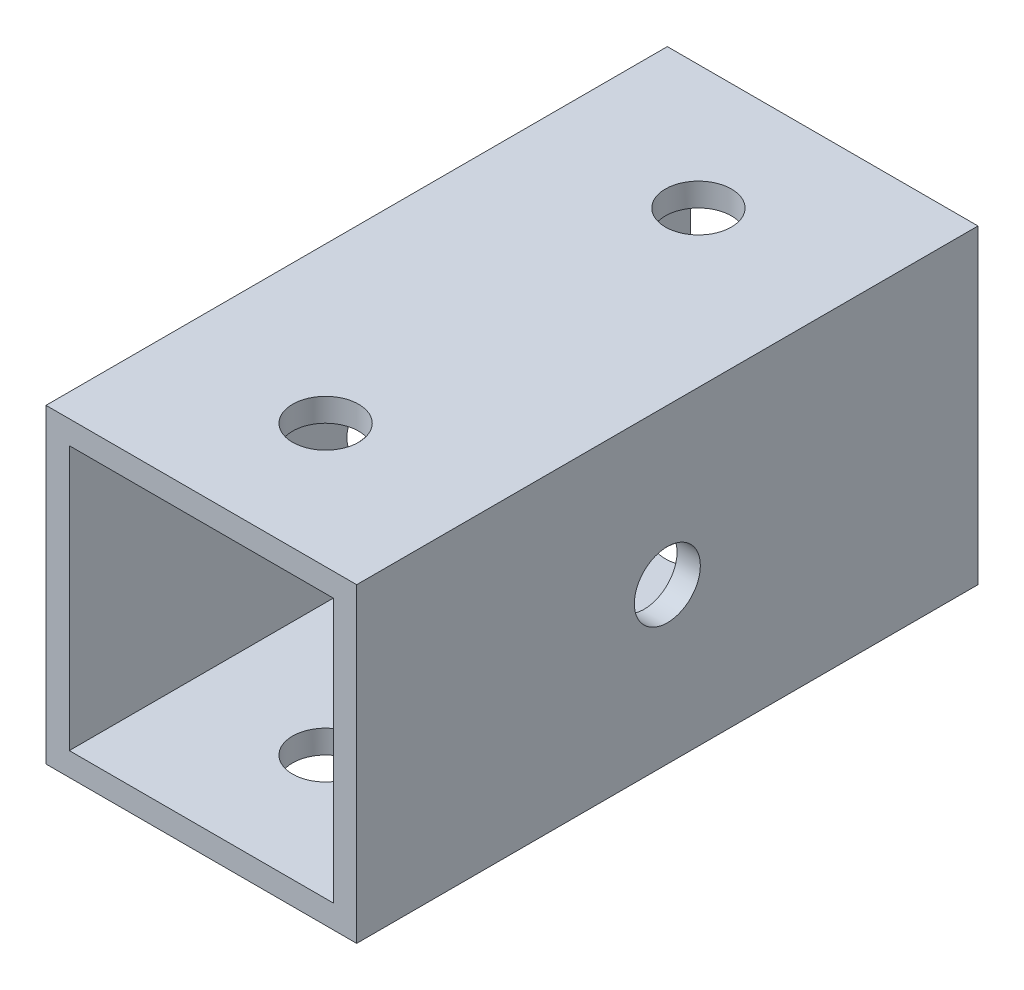
ISO-10303-21;
HEADER;
FILE_DESCRIPTION(('STEP AP214'),'2;1');
FILE_NAME('part.step','',(''),(''),'','','');
FILE_SCHEMA(('AUTOMOTIVE_DESIGN { 1 0 10303 214 1 1 1 1 }'));
ENDSEC;
DATA;
#1=APPLICATION_CONTEXT('core data for automotive mechanical design processes');
#2=APPLICATION_PROTOCOL_DEFINITION('international standard','automotive_design',2000,#1);
#3=PRODUCT_CONTEXT('',#1,'mechanical');
#4=PRODUCT('Part','Part','',(#3));
#5=PRODUCT_RELATED_PRODUCT_CATEGORY('part','',(#4));
#6=PRODUCT_DEFINITION_FORMATION('','',#4);
#7=PRODUCT_DEFINITION_CONTEXT('part definition',#1,'design');
#8=PRODUCT_DEFINITION('design','',#6,#7);
#9=PRODUCT_DEFINITION_SHAPE('','',#8);
#10=(LENGTH_UNIT() NAMED_UNIT(*) SI_UNIT(.MILLI.,.METRE.));
#11=(NAMED_UNIT(*) PLANE_ANGLE_UNIT() SI_UNIT($,.RADIAN.));
#12=(NAMED_UNIT(*) SI_UNIT($,.STERADIAN.) SOLID_ANGLE_UNIT());
#13=UNCERTAINTY_MEASURE_WITH_UNIT(LENGTH_MEASURE(1.E-05),#10,'distance_accuracy_value','');
#14=(GEOMETRIC_REPRESENTATION_CONTEXT(3) GLOBAL_UNCERTAINTY_ASSIGNED_CONTEXT((#13)) GLOBAL_UNIT_ASSIGNED_CONTEXT((#10,
#11,#12)) REPRESENTATION_CONTEXT('',''));
#15=CARTESIAN_POINT('',(0.,0.,0.));
#16=DIRECTION('',(0.,0.,1.));
#17=DIRECTION('',(1.,0.,0.));
#18=AXIS2_PLACEMENT_3D('',#15,#16,#17);
#19=CARTESIAN_POINT('',(10.,-9.99999999999999,-40.));
#20=DIRECTION('',(1.,0.,0.));
#21=DIRECTION('',(0.,0.,-1.));
#22=AXIS2_PLACEMENT_3D('',#19,#20,#21);
#23=PLANE('',#22);
#24=CARTESIAN_POINT('',(10.,0.,-20.));
#25=DIRECTION('',(1.,0.,0.));
#26=DIRECTION('',(0.,0.,-1.));
#27=AXIS2_PLACEMENT_3D('',#24,#25,#26);
#28=CIRCLE('',#27,2.125);
#29=CARTESIAN_POINT('',(10.,0.,-22.125));
#30=VERTEX_POINT('',#29);
#31=EDGE_CURVE('E201',#30,#30,#28,.T.);
#32=ORIENTED_EDGE('',*,*,#31,.F.);
#33=EDGE_LOOP('',(#32));
#34=FACE_BOUND('',#33,.T.);
#35=DIRECTION('',(0.,1.,0.));
#36=VECTOR('',#35,1.);
#37=CARTESIAN_POINT('',(10.,-9.99999999999999,0.));
#38=LINE('',#37,#36);
#39=CARTESIAN_POINT('',(10.,-9.99999999999999,0.));
#40=VERTEX_POINT('',#39);
#41=CARTESIAN_POINT('',(10.,10.,0.));
#42=VERTEX_POINT('',#41);
#43=EDGE_CURVE('E142',#40,#42,#38,.T.);
#44=ORIENTED_EDGE('',*,*,#43,.F.);
#45=DIRECTION('',(0.,0.,1.));
#46=VECTOR('',#45,1.);
#47=CARTESIAN_POINT('',(10.,-9.99999999999999,-40.));
#48=LINE('',#47,#46);
#49=CARTESIAN_POINT('',(10.,-9.99999999999999,-40.));
#50=VERTEX_POINT('',#49);
#51=EDGE_CURVE('E11',#50,#40,#48,.T.);
#52=ORIENTED_EDGE('',*,*,#51,.F.);
#53=DIRECTION('',(0.,1.,0.));
#54=VECTOR('',#53,1.);
#55=CARTESIAN_POINT('',(10.,-9.99999999999999,-40.));
#56=LINE('',#55,#54);
#57=CARTESIAN_POINT('',(10.,10.,-40.));
#58=VERTEX_POINT('',#57);
#59=EDGE_CURVE('E146',#50,#58,#56,.T.);
#60=ORIENTED_EDGE('',*,*,#59,.T.);
#61=DIRECTION('',(0.,0.,1.));
#62=VECTOR('',#61,1.);
#63=CARTESIAN_POINT('',(10.,10.,-40.));
#64=LINE('',#63,#62);
#65=EDGE_CURVE('E159',#58,#42,#64,.T.);
#66=ORIENTED_EDGE('',*,*,#65,.T.);
#67=EDGE_LOOP('',(#44,#52,#60,#66));
#68=FACE_BOUND('',#67,.T.);
#69=ADVANCED_FACE('F41',(#34,#68),#23,.T.);
#70=CARTESIAN_POINT('',(-9.99999999999998,-9.99999999999999,-40.));
#71=DIRECTION('',(0.,-1.,0.));
#72=DIRECTION('',(0.,0.,-1.));
#73=AXIS2_PLACEMENT_3D('',#70,#71,#72);
#74=PLANE('',#73);
#75=CARTESIAN_POINT('',(0.,-9.99999999999999,-8.));
#76=DIRECTION('',(0.,1.,0.));
#77=DIRECTION('',(0.,0.,1.));
#78=AXIS2_PLACEMENT_3D('',#75,#76,#77);
#79=CIRCLE('',#78,2.125);
#80=CARTESIAN_POINT('',(0.,-9.99999999999999,-5.875));
#81=VERTEX_POINT('',#80);
#82=EDGE_CURVE('E177',#81,#81,#79,.T.);
#83=ORIENTED_EDGE('',*,*,#82,.T.);
#84=EDGE_LOOP('',(#83));
#85=FACE_BOUND('',#84,.T.);
#86=CARTESIAN_POINT('',(0.,-9.99999999999999,-32.));
#87=DIRECTION('',(0.,1.,0.));
#88=DIRECTION('',(0.,0.,-1.));
#89=AXIS2_PLACEMENT_3D('',#86,#87,#88);
#90=CIRCLE('',#89,2.125);
#91=CARTESIAN_POINT('',(0.,-9.99999999999999,-34.125));
#92=VERTEX_POINT('',#91);
#93=EDGE_CURVE('E187',#92,#92,#90,.T.);
#94=ORIENTED_EDGE('',*,*,#93,.T.);
#95=EDGE_LOOP('',(#94));
#96=FACE_BOUND('',#95,.T.);
#97=DIRECTION('',(1.,0.,0.));
#98=VECTOR('',#97,1.);
#99=CARTESIAN_POINT('',(-9.99999999999998,-9.99999999999999,0.));
#100=LINE('',#99,#98);
#101=CARTESIAN_POINT('',(-9.99999999999998,-9.99999999999999,0.));
#102=VERTEX_POINT('',#101);
#103=EDGE_CURVE('E150',#102,#40,#100,.T.);
#104=ORIENTED_EDGE('',*,*,#103,.F.);
#105=DIRECTION('',(0.,0.,1.));
#106=VECTOR('',#105,1.);
#107=CARTESIAN_POINT('',(-9.99999999999998,-9.99999999999999,-40.));
#108=LINE('',#107,#106);
#109=CARTESIAN_POINT('',(-9.99999999999998,-9.99999999999999,-40.));
#110=VERTEX_POINT('',#109);
#111=EDGE_CURVE('E49',#110,#102,#108,.T.);
#112=ORIENTED_EDGE('',*,*,#111,.F.);
#113=DIRECTION('',(1.,0.,0.));
#114=VECTOR('',#113,1.);
#115=CARTESIAN_POINT('',(-9.99999999999998,-9.99999999999999,-40.));
#116=LINE('',#115,#114);
#117=EDGE_CURVE('E156',#110,#50,#116,.T.);
#118=ORIENTED_EDGE('',*,*,#117,.T.);
#119=ORIENTED_EDGE('',*,*,#51,.T.);
#120=EDGE_LOOP('',(#104,#112,#118,#119));
#121=FACE_BOUND('',#120,.T.);
#122=ADVANCED_FACE('F230',(#85,#96,#121),#74,.T.);
#123=CARTESIAN_POINT('',(-9.99999999999998,-9.99999999999999,-40.));
#124=DIRECTION('',(-1.,0.,0.));
#125=DIRECTION('',(0.,0.,1.));
#126=AXIS2_PLACEMENT_3D('',#123,#124,#125);
#127=PLANE('',#126);
#128=CARTESIAN_POINT('',(-9.99999999999998,0.,-20.));
#129=DIRECTION('',(1.,0.,0.));
#130=DIRECTION('',(0.,0.,-1.));
#131=AXIS2_PLACEMENT_3D('',#128,#129,#130);
#132=CIRCLE('',#131,2.125);
#133=CARTESIAN_POINT('',(-9.99999999999998,0.,-22.125));
#134=VERTEX_POINT('',#133);
#135=EDGE_CURVE('E204',#134,#134,#132,.T.);
#136=ORIENTED_EDGE('',*,*,#135,.T.);
#137=EDGE_LOOP('',(#136));
#138=FACE_BOUND('',#137,.T.);
#139=DIRECTION('',(0.,-1.,0.));
#140=VECTOR('',#139,1.);
#141=CARTESIAN_POINT('',(-9.99999999999998,-9.99999999999999,0.));
#142=LINE('',#141,#140);
#143=CARTESIAN_POINT('',(-9.99999999999998,10.,0.));
#144=VERTEX_POINT('',#143);
#145=EDGE_CURVE('E165',#144,#102,#142,.T.);
#146=ORIENTED_EDGE('',*,*,#145,.F.);
#147=DIRECTION('',(0.,0.,1.));
#148=VECTOR('',#147,1.);
#149=CARTESIAN_POINT('',(-9.99999999999998,10.,-40.));
#150=LINE('',#149,#148);
#151=CARTESIAN_POINT('',(-9.99999999999998,10.,-40.));
#152=VERTEX_POINT('',#151);
#153=EDGE_CURVE('E171',#152,#144,#150,.T.);
#154=ORIENTED_EDGE('',*,*,#153,.F.);
#155=DIRECTION('',(0.,-1.,0.));
#156=VECTOR('',#155,1.);
#157=CARTESIAN_POINT('',(-9.99999999999998,-9.99999999999999,-40.));
#158=LINE('',#157,#156);
#159=EDGE_CURVE('E153',#152,#110,#158,.T.);
#160=ORIENTED_EDGE('',*,*,#159,.T.);
#161=ORIENTED_EDGE('',*,*,#111,.T.);
#162=EDGE_LOOP('',(#146,#154,#160,#161));
#163=FACE_BOUND('',#162,.T.);
#164=ADVANCED_FACE('F236',(#138,#163),#127,.T.);
#165=CARTESIAN_POINT('',(-9.99999999999998,10.,-40.));
#166=DIRECTION('',(0.,1.,0.));
#167=DIRECTION('',(0.,0.,1.));
#168=AXIS2_PLACEMENT_3D('',#165,#166,#167);
#169=PLANE('',#168);
#170=CARTESIAN_POINT('',(0.,10.,-8.));
#171=DIRECTION('',(0.,1.,0.));
#172=DIRECTION('',(0.,0.,1.));
#173=AXIS2_PLACEMENT_3D('',#170,#171,#172);
#174=CIRCLE('',#173,2.125);
#175=CARTESIAN_POINT('',(0.,10.,-5.875));
#176=VERTEX_POINT('',#175);
#177=EDGE_CURVE('E194',#176,#176,#174,.T.);
#178=ORIENTED_EDGE('',*,*,#177,.F.);
#179=EDGE_LOOP('',(#178));
#180=FACE_BOUND('',#179,.T.);
#181=CARTESIAN_POINT('',(0.,10.,-32.));
#182=DIRECTION('',(0.,1.,0.));
#183=DIRECTION('',(0.,0.,-1.));
#184=AXIS2_PLACEMENT_3D('',#181,#182,#183);
#185=CIRCLE('',#184,2.125);
#186=CARTESIAN_POINT('',(0.,10.,-34.125));
#187=VERTEX_POINT('',#186);
#188=EDGE_CURVE('E190',#187,#187,#185,.T.);
#189=ORIENTED_EDGE('',*,*,#188,.F.);
#190=EDGE_LOOP('',(#189));
#191=FACE_BOUND('',#190,.T.);
#192=DIRECTION('',(-1.,0.,0.));
#193=VECTOR('',#192,1.);
#194=CARTESIAN_POINT('',(-9.99999999999998,10.,0.));
#195=LINE('',#194,#193);
#196=EDGE_CURVE('E162',#42,#144,#195,.T.);
#197=ORIENTED_EDGE('',*,*,#196,.F.);
#198=ORIENTED_EDGE('',*,*,#65,.F.);
#199=DIRECTION('',(-1.,0.,0.));
#200=VECTOR('',#199,1.);
#201=CARTESIAN_POINT('',(-9.99999999999998,10.,-40.));
#202=LINE('',#201,#200);
#203=EDGE_CURVE('E149',#58,#152,#202,.T.);
#204=ORIENTED_EDGE('',*,*,#203,.T.);
#205=ORIENTED_EDGE('',*,*,#153,.T.);
#206=EDGE_LOOP('',(#197,#198,#204,#205));
#207=FACE_BOUND('',#206,.T.);
#208=ADVANCED_FACE('F253',(#180,#191,#207),#169,.T.);
#209=CARTESIAN_POINT('',(0.,0.,-40.));
#210=DIRECTION('',(0.,0.,-1.));
#211=DIRECTION('',(-1.,0.,0.));
#212=AXIS2_PLACEMENT_3D('',#209,#210,#211);
#213=PLANE('',#212);
#214=DIRECTION('',(0.,-1.,0.));
#215=VECTOR('',#214,1.);
#216=CARTESIAN_POINT('',(-8.49999999999998,-8.49999999999999,-40.));
#217=LINE('',#216,#215);
#218=CARTESIAN_POINT('',(-8.49999999999998,8.50000000000002,-40.));
#219=VERTEX_POINT('',#218);
#220=CARTESIAN_POINT('',(-8.49999999999998,-8.49999999999999,-40.));
#221=VERTEX_POINT('',#220);
#222=EDGE_CURVE('E108',#219,#221,#217,.T.);
#223=ORIENTED_EDGE('',*,*,#222,.T.);
#224=DIRECTION('',(1.,0.,0.));
#225=VECTOR('',#224,1.);
#226=CARTESIAN_POINT('',(-8.49999999999998,-8.49999999999999,-40.));
#227=LINE('',#226,#225);
#228=CARTESIAN_POINT('',(8.50000000000002,-8.49999999999999,-40.));
#229=VERTEX_POINT('',#228);
#230=EDGE_CURVE('E117',#221,#229,#227,.T.);
#231=ORIENTED_EDGE('',*,*,#230,.T.);
#232=DIRECTION('',(0.,1.,0.));
#233=VECTOR('',#232,1.);
#234=CARTESIAN_POINT('',(8.50000000000002,-8.49999999999999,-40.));
#235=LINE('',#234,#233);
#236=CARTESIAN_POINT('',(8.50000000000002,8.50000000000002,-40.));
#237=VERTEX_POINT('',#236);
#238=EDGE_CURVE('E57',#229,#237,#235,.T.);
#239=ORIENTED_EDGE('',*,*,#238,.T.);
#240=DIRECTION('',(-1.,0.,0.));
#241=VECTOR('',#240,1.);
#242=CARTESIAN_POINT('',(-8.49999999999998,8.50000000000002,-40.));
#243=LINE('',#242,#241);
#244=EDGE_CURVE('E114',#237,#219,#243,.T.);
#245=ORIENTED_EDGE('',*,*,#244,.T.);
#246=EDGE_LOOP('',(#223,#231,#239,#245));
#247=FACE_BOUND('',#246,.T.);
#248=ORIENTED_EDGE('',*,*,#59,.F.);
#249=ORIENTED_EDGE('',*,*,#117,.F.);
#250=ORIENTED_EDGE('',*,*,#159,.F.);
#251=ORIENTED_EDGE('',*,*,#203,.F.);
#252=EDGE_LOOP('',(#248,#249,#250,#251));
#253=FACE_BOUND('',#252,.T.);
#254=ADVANCED_FACE('F121',(#247,#253),#213,.T.);
#255=CARTESIAN_POINT('',(0.,0.,0.));
#256=DIRECTION('',(0.,0.,-1.));
#257=DIRECTION('',(-1.,0.,0.));
#258=AXIS2_PLACEMENT_3D('',#255,#256,#257);
#259=PLANE('',#258);
#260=DIRECTION('',(1.,0.,0.));
#261=VECTOR('',#260,1.);
#262=CARTESIAN_POINT('',(-8.49999999999998,-8.49999999999999,0.));
#263=LINE('',#262,#261);
#264=CARTESIAN_POINT('',(-8.49999999999998,-8.49999999999999,0.));
#265=VERTEX_POINT('',#264);
#266=CARTESIAN_POINT('',(8.50000000000002,-8.49999999999999,0.));
#267=VERTEX_POINT('',#266);
#268=EDGE_CURVE('E136',#265,#267,#263,.T.);
#269=ORIENTED_EDGE('',*,*,#268,.F.);
#270=DIRECTION('',(0.,-1.,0.));
#271=VECTOR('',#270,1.);
#272=CARTESIAN_POINT('',(-8.49999999999998,-8.49999999999999,0.));
#273=LINE('',#272,#271);
#274=CARTESIAN_POINT('',(-8.49999999999998,8.50000000000002,0.));
#275=VERTEX_POINT('',#274);
#276=EDGE_CURVE('E65',#275,#265,#273,.T.);
#277=ORIENTED_EDGE('',*,*,#276,.F.);
#278=DIRECTION('',(-1.,0.,0.));
#279=VECTOR('',#278,1.);
#280=CARTESIAN_POINT('',(-8.49999999999998,8.50000000000002,0.));
#281=LINE('',#280,#279);
#282=CARTESIAN_POINT('',(8.50000000000002,8.50000000000002,0.));
#283=VERTEX_POINT('',#282);
#284=EDGE_CURVE('E124',#283,#275,#281,.T.);
#285=ORIENTED_EDGE('',*,*,#284,.F.);
#286=DIRECTION('',(0.,1.,0.));
#287=VECTOR('',#286,1.);
#288=CARTESIAN_POINT('',(8.50000000000002,-8.49999999999999,0.));
#289=LINE('',#288,#287);
#290=EDGE_CURVE('E127',#267,#283,#289,.T.);
#291=ORIENTED_EDGE('',*,*,#290,.F.);
#292=EDGE_LOOP('',(#269,#277,#285,#291));
#293=FACE_BOUND('',#292,.T.);
#294=ORIENTED_EDGE('',*,*,#43,.T.);
#295=ORIENTED_EDGE('',*,*,#196,.T.);
#296=ORIENTED_EDGE('',*,*,#145,.T.);
#297=ORIENTED_EDGE('',*,*,#103,.T.);
#298=EDGE_LOOP('',(#294,#295,#296,#297));
#299=FACE_BOUND('',#298,.T.);
#300=ADVANCED_FACE('F246',(#293,#299),#259,.F.);
#301=CARTESIAN_POINT('',(-8.49999999999998,-8.49999999999999,-40.));
#302=DIRECTION('',(-1.,0.,0.));
#303=DIRECTION('',(0.,0.,1.));
#304=AXIS2_PLACEMENT_3D('',#301,#302,#303);
#305=PLANE('',#304);
#306=CARTESIAN_POINT('',(-8.49999999999998,0.,-20.));
#307=DIRECTION('',(-1.,0.,0.));
#308=DIRECTION('',(0.,0.,1.));
#309=AXIS2_PLACEMENT_3D('',#306,#307,#308);
#310=CIRCLE('',#309,2.125);
#311=CARTESIAN_POINT('',(-8.49999999999998,0.,-17.875));
#312=VERTEX_POINT('',#311);
#313=EDGE_CURVE('E191',#312,#312,#310,.T.);
#314=ORIENTED_EDGE('',*,*,#313,.T.);
#315=EDGE_LOOP('',(#314));
#316=FACE_BOUND('',#315,.T.);
#317=ORIENTED_EDGE('',*,*,#276,.T.);
#318=DIRECTION('',(0.,0.,1.));
#319=VECTOR('',#318,1.);
#320=CARTESIAN_POINT('',(-8.49999999999998,-8.49999999999999,-40.));
#321=LINE('',#320,#319);
#322=EDGE_CURVE('E104',#221,#265,#321,.T.);
#323=ORIENTED_EDGE('',*,*,#322,.F.);
#324=ORIENTED_EDGE('',*,*,#222,.F.);
#325=DIRECTION('',(0.,0.,1.));
#326=VECTOR('',#325,1.);
#327=CARTESIAN_POINT('',(-8.49999999999998,8.50000000000002,-40.));
#328=LINE('',#327,#326);
#329=EDGE_CURVE('E140',#219,#275,#328,.T.);
#330=ORIENTED_EDGE('',*,*,#329,.T.);
#331=EDGE_LOOP('',(#317,#323,#324,#330));
#332=FACE_BOUND('',#331,.T.);
#333=ADVANCED_FACE('F106',(#316,#332),#305,.F.);
#334=CARTESIAN_POINT('',(-8.49999999999998,8.50000000000002,-40.));
#335=DIRECTION('',(0.,1.,0.));
#336=DIRECTION('',(0.,0.,1.));
#337=AXIS2_PLACEMENT_3D('',#334,#335,#336);
#338=PLANE('',#337);
#339=CARTESIAN_POINT('',(0.,8.50000000000002,-8.));
#340=DIRECTION('',(0.,1.,0.));
#341=DIRECTION('',(0.,0.,1.));
#342=AXIS2_PLACEMENT_3D('',#339,#340,#341);
#343=CIRCLE('',#342,2.125);
#344=CARTESIAN_POINT('',(0.,8.50000000000002,-5.875));
#345=VERTEX_POINT('',#344);
#346=EDGE_CURVE('E130',#345,#345,#343,.T.);
#347=ORIENTED_EDGE('',*,*,#346,.T.);
#348=EDGE_LOOP('',(#347));
#349=FACE_BOUND('',#348,.T.);
#350=CARTESIAN_POINT('',(0.,8.50000000000002,-32.));
#351=DIRECTION('',(0.,1.,0.));
#352=DIRECTION('',(0.,0.,1.));
#353=AXIS2_PLACEMENT_3D('',#350,#351,#352);
#354=CIRCLE('',#353,2.125);
#355=CARTESIAN_POINT('',(0.,8.50000000000002,-29.875));
#356=VERTEX_POINT('',#355);
#357=EDGE_CURVE('E176',#356,#356,#354,.T.);
#358=ORIENTED_EDGE('',*,*,#357,.T.);
#359=EDGE_LOOP('',(#358));
#360=FACE_BOUND('',#359,.T.);
#361=ORIENTED_EDGE('',*,*,#284,.T.);
#362=ORIENTED_EDGE('',*,*,#329,.F.);
#363=ORIENTED_EDGE('',*,*,#244,.F.);
#364=DIRECTION('',(0.,0.,1.));
#365=VECTOR('',#364,1.);
#366=CARTESIAN_POINT('',(8.50000000000002,8.50000000000002,-40.));
#367=LINE('',#366,#365);
#368=EDGE_CURVE('E143',#237,#283,#367,.T.);
#369=ORIENTED_EDGE('',*,*,#368,.T.);
#370=EDGE_LOOP('',(#361,#362,#363,#369));
#371=FACE_BOUND('',#370,.T.);
#372=ADVANCED_FACE('F268',(#349,#360,#371),#338,.F.);
#373=CARTESIAN_POINT('',(8.50000000000002,-8.49999999999999,-40.));
#374=DIRECTION('',(1.,0.,0.));
#375=DIRECTION('',(0.,0.,-1.));
#376=AXIS2_PLACEMENT_3D('',#373,#374,#375);
#377=PLANE('',#376);
#378=CARTESIAN_POINT('',(8.50000000000003,0.,-20.));
#379=DIRECTION('',(1.,0.,0.));
#380=DIRECTION('',(0.,0.,-1.));
#381=AXIS2_PLACEMENT_3D('',#378,#379,#380);
#382=CIRCLE('',#381,2.125);
#383=CARTESIAN_POINT('',(8.50000000000003,0.,-22.125));
#384=VERTEX_POINT('',#383);
#385=EDGE_CURVE('E44',#384,#384,#382,.T.);
#386=ORIENTED_EDGE('',*,*,#385,.T.);
#387=EDGE_LOOP('',(#386));
#388=FACE_BOUND('',#387,.T.);
#389=ORIENTED_EDGE('',*,*,#290,.T.);
#390=ORIENTED_EDGE('',*,*,#368,.F.);
#391=ORIENTED_EDGE('',*,*,#238,.F.);
#392=DIRECTION('',(0.,0.,1.));
#393=VECTOR('',#392,1.);
#394=CARTESIAN_POINT('',(8.50000000000002,-8.49999999999999,-40.));
#395=LINE('',#394,#393);
#396=EDGE_CURVE('E113',#229,#267,#395,.T.);
#397=ORIENTED_EDGE('',*,*,#396,.T.);
#398=EDGE_LOOP('',(#389,#390,#391,#397));
#399=FACE_BOUND('',#398,.T.);
#400=ADVANCED_FACE('F211',(#388,#399),#377,.F.);
#401=CARTESIAN_POINT('',(-8.49999999999998,-8.49999999999999,-40.));
#402=DIRECTION('',(0.,-1.,0.));
#403=DIRECTION('',(0.,0.,-1.));
#404=AXIS2_PLACEMENT_3D('',#401,#402,#403);
#405=PLANE('',#404);
#406=CARTESIAN_POINT('',(0.,-8.49999999999999,-8.));
#407=DIRECTION('',(0.,-1.,0.));
#408=DIRECTION('',(0.,0.,-1.));
#409=AXIS2_PLACEMENT_3D('',#406,#407,#408);
#410=CIRCLE('',#409,2.125);
#411=CARTESIAN_POINT('',(0.,-8.49999999999999,-10.125));
#412=VERTEX_POINT('',#411);
#413=EDGE_CURVE('E178',#412,#412,#410,.T.);
#414=ORIENTED_EDGE('',*,*,#413,.T.);
#415=EDGE_LOOP('',(#414));
#416=FACE_BOUND('',#415,.T.);
#417=CARTESIAN_POINT('',(0.,-8.49999999999999,-32.));
#418=DIRECTION('',(0.,-1.,0.));
#419=DIRECTION('',(0.,0.,-1.));
#420=AXIS2_PLACEMENT_3D('',#417,#418,#419);
#421=CIRCLE('',#420,2.125);
#422=CARTESIAN_POINT('',(0.,-8.49999999999999,-34.125));
#423=VERTEX_POINT('',#422);
#424=EDGE_CURVE('E174',#423,#423,#421,.T.);
#425=ORIENTED_EDGE('',*,*,#424,.T.);
#426=EDGE_LOOP('',(#425));
#427=FACE_BOUND('',#426,.T.);
#428=ORIENTED_EDGE('',*,*,#268,.T.);
#429=ORIENTED_EDGE('',*,*,#396,.F.);
#430=ORIENTED_EDGE('',*,*,#230,.F.);
#431=ORIENTED_EDGE('',*,*,#322,.T.);
#432=EDGE_LOOP('',(#428,#429,#430,#431));
#433=FACE_BOUND('',#432,.T.);
#434=ADVANCED_FACE('F118',(#416,#427,#433),#405,.F.);
#435=CARTESIAN_POINT('',(0.,-9.99999999999999,-32.));
#436=DIRECTION('',(0.,1.,0.));
#437=DIRECTION('',(0.,0.,1.));
#438=AXIS2_PLACEMENT_3D('',#435,#436,#437);
#439=CYLINDRICAL_SURFACE('',#438,2.125);
#440=ORIENTED_EDGE('',*,*,#93,.F.);
#441=EDGE_LOOP('',(#440));
#442=FACE_BOUND('',#441,.T.);
#443=ORIENTED_EDGE('',*,*,#424,.F.);
#444=EDGE_LOOP('',(#443));
#445=FACE_BOUND('',#444,.T.);
#446=ADVANCED_FACE('F272',(#442,#445),#439,.F.);
#447=CARTESIAN_POINT('',(0.,-9.99999999999999,-8.));
#448=DIRECTION('',(0.,1.,0.));
#449=DIRECTION('',(0.,0.,1.));
#450=AXIS2_PLACEMENT_3D('',#447,#448,#449);
#451=CYLINDRICAL_SURFACE('',#450,2.125);
#452=ORIENTED_EDGE('',*,*,#82,.F.);
#453=EDGE_LOOP('',(#452));
#454=FACE_BOUND('',#453,.T.);
#455=ORIENTED_EDGE('',*,*,#413,.F.);
#456=EDGE_LOOP('',(#455));
#457=FACE_BOUND('',#456,.T.);
#458=ADVANCED_FACE('F228',(#454,#457),#451,.F.);
#459=ORIENTED_EDGE('',*,*,#188,.T.);
#460=EDGE_LOOP('',(#459));
#461=FACE_BOUND('',#460,.T.);
#462=ORIENTED_EDGE('',*,*,#357,.F.);
#463=EDGE_LOOP('',(#462));
#464=FACE_BOUND('',#463,.T.);
#465=ADVANCED_FACE('F225',(#461,#464),#439,.F.);
#466=ORIENTED_EDGE('',*,*,#177,.T.);
#467=EDGE_LOOP('',(#466));
#468=FACE_BOUND('',#467,.T.);
#469=ORIENTED_EDGE('',*,*,#346,.F.);
#470=EDGE_LOOP('',(#469));
#471=FACE_BOUND('',#470,.T.);
#472=ADVANCED_FACE('F216',(#468,#471),#451,.F.);
#473=CARTESIAN_POINT('',(-9.99999999999998,0.,-20.));
#474=DIRECTION('',(1.,0.,0.));
#475=DIRECTION('',(0.,0.,-1.));
#476=AXIS2_PLACEMENT_3D('',#473,#474,#475);
#477=CYLINDRICAL_SURFACE('',#476,2.125);
#478=ORIENTED_EDGE('',*,*,#31,.T.);
#479=EDGE_LOOP('',(#478));
#480=FACE_BOUND('',#479,.T.);
#481=ORIENTED_EDGE('',*,*,#385,.F.);
#482=EDGE_LOOP('',(#481));
#483=FACE_BOUND('',#482,.T.);
#484=ADVANCED_FACE('F213',(#480,#483),#477,.F.);
#485=ORIENTED_EDGE('',*,*,#135,.F.);
#486=EDGE_LOOP('',(#485));
#487=FACE_BOUND('',#486,.T.);
#488=ORIENTED_EDGE('',*,*,#313,.F.);
#489=EDGE_LOOP('',(#488));
#490=FACE_BOUND('',#489,.T.);
#491=ADVANCED_FACE('F215',(#487,#490),#477,.F.);
#492=CLOSED_SHELL('',(#69,#122,#164,#208,#254,#300,#333,#372,#400,#434,#446,#458,#465,#472,#484,#491));
#493=MANIFOLD_SOLID_BREP('B2',#492);
#494=ADVANCED_BREP_SHAPE_REPRESENTATION('',(#18,#493),#14);
#495=SHAPE_DEFINITION_REPRESENTATION(#9,#494);
ENDSEC;
END-ISO-10303-21;
